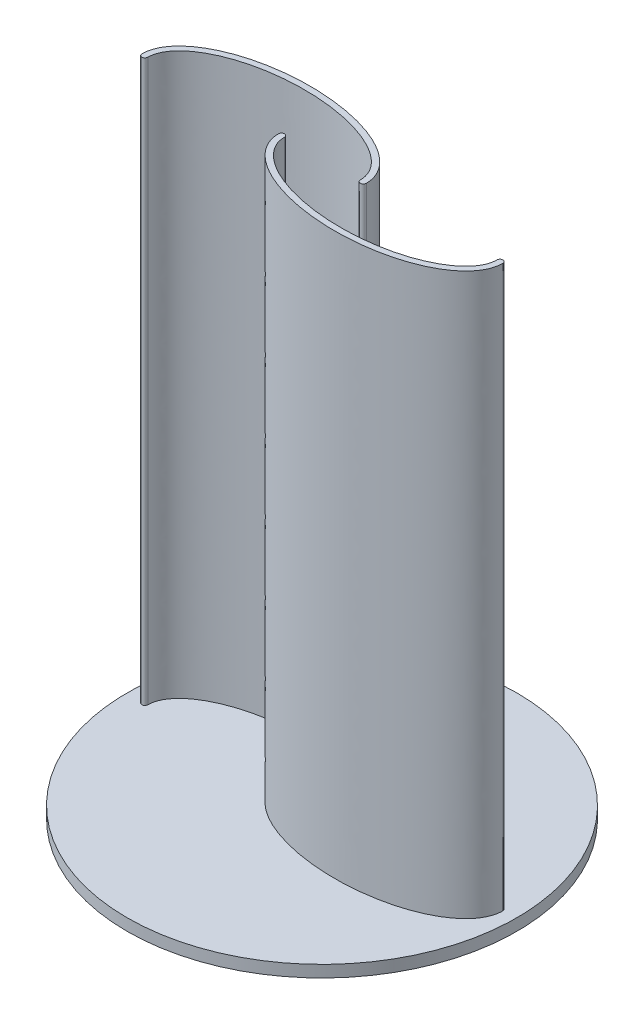
ISO-10303-21;
HEADER;
FILE_DESCRIPTION(('STEP AP214'),'2;1');
FILE_NAME('part.step','',(''),(''),'','','');
FILE_SCHEMA(('AUTOMOTIVE_DESIGN { 1 0 10303 214 1 1 1 1 }'));
ENDSEC;
DATA;
#1=APPLICATION_CONTEXT('core data for automotive mechanical design processes');
#2=APPLICATION_PROTOCOL_DEFINITION('international standard','automotive_design',2000,#1);
#3=PRODUCT_CONTEXT('',#1,'mechanical');
#4=PRODUCT('Part','Part','',(#3));
#5=PRODUCT_RELATED_PRODUCT_CATEGORY('part','',(#4));
#6=PRODUCT_DEFINITION_FORMATION('','',#4);
#7=PRODUCT_DEFINITION_CONTEXT('part definition',#1,'design');
#8=PRODUCT_DEFINITION('design','',#6,#7);
#9=PRODUCT_DEFINITION_SHAPE('','',#8);
#10=(LENGTH_UNIT() NAMED_UNIT(*) SI_UNIT(.MILLI.,.METRE.));
#11=(NAMED_UNIT(*) PLANE_ANGLE_UNIT() SI_UNIT($,.RADIAN.));
#12=(NAMED_UNIT(*) SI_UNIT($,.STERADIAN.) SOLID_ANGLE_UNIT());
#13=UNCERTAINTY_MEASURE_WITH_UNIT(LENGTH_MEASURE(1.E-05),#10,'distance_accuracy_value','');
#14=(GEOMETRIC_REPRESENTATION_CONTEXT(3) GLOBAL_UNCERTAINTY_ASSIGNED_CONTEXT((#13)) GLOBAL_UNIT_ASSIGNED_CONTEXT((#10,
#11,#12)) REPRESENTATION_CONTEXT('',''));
#15=CARTESIAN_POINT('',(0.,0.,0.));
#16=DIRECTION('',(0.,0.,1.));
#17=DIRECTION('',(1.,0.,0.));
#18=AXIS2_PLACEMENT_3D('',#15,#16,#17);
#19=CARTESIAN_POINT('',(0.,0.,0.));
#20=DIRECTION('',(0.,1.,0.));
#21=DIRECTION('',(0.,0.,1.));
#22=AXIS2_PLACEMENT_3D('',#19,#20,#21);
#23=PLANE('',#22);
#24=CARTESIAN_POINT('',(0.,0.,0.));
#25=DIRECTION('',(0.,1.,0.));
#26=DIRECTION('',(0.,0.,1.));
#27=AXIS2_PLACEMENT_3D('',#24,#25,#26);
#28=CIRCLE('',#27,330.);
#29=CARTESIAN_POINT('',(0.,0.,330.));
#30=VERTEX_POINT('',#29);
#31=EDGE_CURVE('E116',#30,#30,#28,.T.);
#32=ORIENTED_EDGE('',*,*,#31,.T.);
#33=EDGE_LOOP('',(#32));
#34=FACE_BOUND('',#33,.T.);
#35=CARTESIAN_POINT('',(70.,0.,0.));
#36=DIRECTION('',(0.,1.,0.));
#37=DIRECTION('',(0.,0.,1.));
#38=AXIS2_PLACEMENT_3D('',#35,#36,#37);
#39=CIRCLE('',#38,5.);
#40=CARTESIAN_POINT('',(75.,0.,0.));
#41=VERTEX_POINT('',#40);
#42=CARTESIAN_POINT('',(65.,0.,0.));
#43=VERTEX_POINT('',#42);
#44=EDGE_CURVE('E194',#41,#43,#39,.F.);
#45=ORIENTED_EDGE('',*,*,#44,.T.);
#46=CARTESIAN_POINT('',(65.,0.,0.));
#47=CARTESIAN_POINT('',(65.,0.,-2.6230982494659));
#48=CARTESIAN_POINT('',(64.4746875253035,0.,-7.82050914147198));
#49=CARTESIAN_POINT('',(62.090181139441,0.,-15.6699622828259));
#50=CARTESIAN_POINT('',(58.0677439881759,0.,-23.4945563482025));
#51=CARTESIAN_POINT('',(50.4921446518239,0.,-33.8114091738083));
#52=CARTESIAN_POINT('',(36.8928019571576,0.,-46.225848965294));
#53=CARTESIAN_POINT('',(14.490118809809,0.,-59.523225114945));
#54=CARTESIAN_POINT('',(-13.0887216448055,0.,-70.5418597532879));
#55=CARTESIAN_POINT('',(-44.7264008775219,0.,-78.7724066663925));
#56=CARTESIAN_POINT('',(-79.1532223977607,0.,-83.8546077500835));
#57=CARTESIAN_POINT('',(-115.,0.,-85.5726961249583));
#58=CARTESIAN_POINT('',(-150.84677760224,0.,-83.8546077500835));
#59=CARTESIAN_POINT('',(-185.273599122478,0.,-78.7724066663925));
#60=CARTESIAN_POINT('',(-216.911278355195,0.,-70.5418597532879));
#61=CARTESIAN_POINT('',(-244.490118809809,0.,-59.523225114945));
#62=CARTESIAN_POINT('',(-266.892801957158,0.,-46.225848965294));
#63=CARTESIAN_POINT('',(-280.492144651824,0.,-33.8114091738083));
#64=CARTESIAN_POINT('',(-288.067743988176,0.,-23.4945563482024));
#65=CARTESIAN_POINT('',(-292.090181139441,0.,-15.6699622828258));
#66=CARTESIAN_POINT('',(-294.474687525304,0.,-7.82050914147193));
#67=CARTESIAN_POINT('',(-295.,0.,-2.62309824946584));
#68=CARTESIAN_POINT('',(-295.,0.,0.));
#69=B_SPLINE_CURVE_WITH_KNOTS('',3,(#46,#47,#48,#49,#50,#51,#52,#53,#54,#55,#56,#57,#58,#59,#60,
#61,#62,#63,#64,#65,#66,#67,#68),.UNSPECIFIED.,.F.,.F.,(4,1,1,1,1,1,1,1,1,1,1,1,1,1,1,1,1,1,1,1,
4),(0.,0.0981747704246811,0.196349540849362,0.294524311274043,0.392699081698724,
0.589048622548086,0.785398163397449,0.981747704246811,1.17809724509617,1.37444678594554,
1.5707963267949,1.76714586764426,1.96349540849362,2.15984494934298,2.35619449019235,
2.55254403104171,2.74889357189107,2.84706834231575,2.94524311274043,3.04341788316511,
3.14159265358979),.UNSPECIFIED.);
#70=CARTESIAN_POINT('',(-295.,0.,0.));
#71=VERTEX_POINT('',#70);
#72=EDGE_CURVE('E189',#43,#71,#69,.T.);
#73=ORIENTED_EDGE('',*,*,#72,.T.);
#74=CARTESIAN_POINT('',(-300.,0.,0.));
#75=DIRECTION('',(0.,1.,0.));
#76=DIRECTION('',(0.,0.,1.));
#77=AXIS2_PLACEMENT_3D('',#74,#75,#76);
#78=CIRCLE('',#77,5.);
#79=CARTESIAN_POINT('',(-305.,0.,0.));
#80=VERTEX_POINT('',#79);
#81=EDGE_CURVE('E205',#80,#71,#78,.T.);
#82=ORIENTED_EDGE('',*,*,#81,.F.);
#83=CARTESIAN_POINT('',(75.,0.,0.));
#84=CARTESIAN_POINT('',(75.,0.,-3.28784020371299));
#85=CARTESIAN_POINT('',(74.3356593466837,0.,-9.84121686231741));
#86=CARTESIAN_POINT('',(70.3997109122801,0.,-22.7277284859852));
#87=CARTESIAN_POINT('',(60.8247211158811,0.,-38.0009422056469));
#88=CARTESIAN_POINT('',(42.7346393341913,0.,-54.4207270814239));
#89=CARTESIAN_POINT('',(18.825921029807,0.,-68.5768589381955));
#90=CARTESIAN_POINT('',(-10.0258247708729,0.,-80.0865516689035));
#91=CARTESIAN_POINT('',(-53.6787730708616,0.,-91.4392092816324));
#92=CARTESIAN_POINT('',(-115.,0.,-97.3738604789117));
#93=CARTESIAN_POINT('',(-176.321226929139,0.,-91.4392092816324));
#94=CARTESIAN_POINT('',(-219.974175229127,0.,-80.0865516689035));
#95=CARTESIAN_POINT('',(-248.825921029807,0.,-68.5768589381955));
#96=CARTESIAN_POINT('',(-272.734639334192,0.,-54.4207270814239));
#97=CARTESIAN_POINT('',(-290.824721115881,0.,-38.0009422056468));
#98=CARTESIAN_POINT('',(-300.39971091228,0.,-22.7277284859851));
#99=CARTESIAN_POINT('',(-304.335659346684,0.,-9.84121686231733));
#100=CARTESIAN_POINT('',(-305.,0.,-3.28784020371291));
#101=CARTESIAN_POINT('',(-305.,0.,0.));
#102=B_SPLINE_CURVE_WITH_KNOTS('',3,(#83,#84,#85,#86,#87,#88,#89,#90,#91,#92,#93,#94,#95,#96,
#97,#98,#99,#100,#101),.UNSPECIFIED.,.F.,.F.,(4,1,1,1,1,1,1,1,1,1,1,1,1,1,1,1,4),(0.,
0.0981747704246811,0.196349540849362,0.392699081698724,0.589048622548086,0.785398163397449,
0.981747704246811,1.17809724509617,1.5707963267949,1.96349540849362,2.15984494934298,
2.35619449019235,2.55254403104171,2.74889357189107,2.94524311274043,3.04341788316511,
3.14159265358979),.UNSPECIFIED.);
#103=EDGE_CURVE('E201',#41,#80,#102,.T.);
#104=ORIENTED_EDGE('',*,*,#103,.F.);
#105=EDGE_LOOP('',(#45,#73,#82,#104));
#106=FACE_BOUND('',#105,.T.);
#107=CARTESIAN_POINT('',(-61.9293275410539,0.,1.67827771019427));
#108=CARTESIAN_POINT('',(-61.9293275410539,0.,4.30137595966018));
#109=CARTESIAN_POINT('',(-61.4040150663574,0.,9.49878685166627));
#110=CARTESIAN_POINT('',(-59.0195086804949,0.,17.3482399930202));
#111=CARTESIAN_POINT('',(-54.9970715292298,0.,25.1728340583968));
#112=CARTESIAN_POINT('',(-47.4214721928778,0.,35.4896868840026));
#113=CARTESIAN_POINT('',(-33.8221294982115,0.,47.9041266754883));
#114=CARTESIAN_POINT('',(-11.4194463508629,0.,61.2015028251393));
#115=CARTESIAN_POINT('',(16.1593941037516,0.,72.2201374634822));
#116=CARTESIAN_POINT('',(47.797073336468,0.,80.4506843765868));
#117=CARTESIAN_POINT('',(82.2238948567068,0.,85.5328854602778));
#118=CARTESIAN_POINT('',(118.070672458946,0.,87.2509738351526));
#119=CARTESIAN_POINT('',(153.917450061186,0.,85.5328854602778));
#120=CARTESIAN_POINT('',(188.344271581424,0.,80.4506843765868));
#121=CARTESIAN_POINT('',(219.981950814141,0.,72.2201374634822));
#122=CARTESIAN_POINT('',(247.560791268755,0.,61.2015028251392));
#123=CARTESIAN_POINT('',(269.963474416104,0.,47.9041266754883));
#124=CARTESIAN_POINT('',(283.56281711077,0.,35.4896868840026));
#125=CARTESIAN_POINT('',(291.138416447122,0.,25.1728340583967));
#126=CARTESIAN_POINT('',(295.160853598387,0.,17.3482399930201));
#127=CARTESIAN_POINT('',(297.54535998425,0.,9.49878685166621));
#128=CARTESIAN_POINT('',(298.070672458946,0.,4.30137595966013));
#129=CARTESIAN_POINT('',(298.070672458946,0.,1.67827771019422));
#130=B_SPLINE_CURVE_WITH_KNOTS('',3,(#107,#108,#109,#110,#111,#112,#113,#114,#115,#116,#117,
#118,#119,#120,#121,#122,#123,#124,#125,#126,#127,#128,#129),.UNSPECIFIED.,.F.,.F.,(4,1,1,1,1,1,
1,1,1,1,1,1,1,1,1,1,1,1,1,1,4),(0.,0.0981747704246811,0.196349540849362,0.294524311274043,
0.392699081698724,0.589048622548086,0.785398163397449,0.981747704246811,1.17809724509617,
1.37444678594554,1.5707963267949,1.76714586764426,1.96349540849362,2.15984494934298,
2.35619449019235,2.55254403104171,2.74889357189107,2.84706834231575,2.94524311274043,
3.04341788316511,3.14159265358979),.UNSPECIFIED.);
#131=CARTESIAN_POINT('',(-61.9293275410539,0.,1.67827771019427));
#132=VERTEX_POINT('',#131);
#133=CARTESIAN_POINT('',(298.070672458946,0.,1.67827771019422));
#134=VERTEX_POINT('',#133);
#135=EDGE_CURVE('E111',#132,#134,#130,.T.);
#136=ORIENTED_EDGE('',*,*,#135,.T.);
#137=CARTESIAN_POINT('',(303.070672458946,0.,1.6782777101942));
#138=DIRECTION('',(0.,1.,0.));
#139=DIRECTION('',(0.,0.,-1.));
#140=AXIS2_PLACEMENT_3D('',#137,#138,#139);
#141=CIRCLE('',#140,5.);
#142=CARTESIAN_POINT('',(308.070672458946,0.,1.6782777101942));
#143=VERTEX_POINT('',#142);
#144=EDGE_CURVE('E125',#143,#134,#141,.T.);
#145=ORIENTED_EDGE('',*,*,#144,.F.);
#146=CARTESIAN_POINT('',(-71.9293275410539,0.,1.67827771019427));
#147=CARTESIAN_POINT('',(-71.9293275410539,0.,4.96611791390727));
#148=CARTESIAN_POINT('',(-71.2649868877376,0.,11.5194945725117));
#149=CARTESIAN_POINT('',(-67.329038453334,0.,24.4060061961795));
#150=CARTESIAN_POINT('',(-57.754048656935,0.,39.6792199158412));
#151=CARTESIAN_POINT('',(-39.6639668752453,0.,56.0990047916182));
#152=CARTESIAN_POINT('',(-15.755248570861,0.,70.2551366483898));
#153=CARTESIAN_POINT('',(13.096497229819,0.,81.7648293790978));
#154=CARTESIAN_POINT('',(56.7494455298077,0.,93.1174869918267));
#155=CARTESIAN_POINT('',(118.070672458946,0.,99.052138189106));
#156=CARTESIAN_POINT('',(179.391899388085,0.,93.1174869918267));
#157=CARTESIAN_POINT('',(223.044847688073,0.,81.7648293790978));
#158=CARTESIAN_POINT('',(251.896593488753,0.,70.2551366483898));
#159=CARTESIAN_POINT('',(275.805311793138,0.,56.0990047916182));
#160=CARTESIAN_POINT('',(293.895393574827,0.,39.6792199158411));
#161=CARTESIAN_POINT('',(303.470383371226,0.,24.4060061961794));
#162=CARTESIAN_POINT('',(307.40633180563,0.,11.5194945725116));
#163=CARTESIAN_POINT('',(308.070672458946,0.,4.9661179139072));
#164=CARTESIAN_POINT('',(308.070672458946,0.,1.6782777101942));
#165=B_SPLINE_CURVE_WITH_KNOTS('',3,(#146,#147,#148,#149,#150,#151,#152,#153,#154,#155,#156,
#157,#158,#159,#160,#161,#162,#163,#164),.UNSPECIFIED.,.F.,.F.,(4,1,1,1,1,1,1,1,1,1,1,1,1,1,1,1,
4),(0.,0.0981747704246811,0.196349540849362,0.392699081698724,0.589048622548086,
0.785398163397449,0.981747704246811,1.17809724509617,1.5707963267949,1.96349540849362,
2.15984494934298,2.35619449019235,2.55254403104171,2.74889357189107,2.94524311274043,
3.04341788316511,3.14159265358979),.UNSPECIFIED.);
#166=CARTESIAN_POINT('',(-71.9293275410539,0.,1.67827771019427));
#167=VERTEX_POINT('',#166);
#168=EDGE_CURVE('E240',#167,#143,#165,.T.);
#169=ORIENTED_EDGE('',*,*,#168,.F.);
#170=CARTESIAN_POINT('',(-66.9293275410539,0.,1.67827771019427));
#171=DIRECTION('',(0.,1.,0.));
#172=DIRECTION('',(0.,0.,-1.));
#173=AXIS2_PLACEMENT_3D('',#170,#171,#172);
#174=CIRCLE('',#173,5.);
#175=EDGE_CURVE('E244',#167,#132,#174,.F.);
#176=ORIENTED_EDGE('',*,*,#175,.T.);
#177=EDGE_LOOP('',(#136,#145,#169,#176));
#178=FACE_BOUND('',#177,.T.);
#179=ADVANCED_FACE('F33',(#34,#106,#178),#23,.T.);
#180=CARTESIAN_POINT('',(65.,950.,0.));
#181=CARTESIAN_POINT('',(65.,950.,-2.6230982494659));
#182=CARTESIAN_POINT('',(64.4746875253035,950.,-7.82050914147198));
#183=CARTESIAN_POINT('',(62.090181139441,950.,-15.6699622828259));
#184=CARTESIAN_POINT('',(58.0677439881759,950.,-23.4945563482025));
#185=CARTESIAN_POINT('',(50.4921446518239,950.,-33.8114091738083));
#186=CARTESIAN_POINT('',(36.8928019571576,950.,-46.225848965294));
#187=CARTESIAN_POINT('',(14.490118809809,950.,-59.523225114945));
#188=CARTESIAN_POINT('',(-13.0887216448055,950.,-70.5418597532879));
#189=CARTESIAN_POINT('',(-44.7264008775219,950.,-78.7724066663925));
#190=CARTESIAN_POINT('',(-79.1532223977607,950.,-83.8546077500835));
#191=CARTESIAN_POINT('',(-115.,950.,-85.5726961249583));
#192=CARTESIAN_POINT('',(-150.84677760224,950.,-83.8546077500835));
#193=CARTESIAN_POINT('',(-185.273599122478,950.,-78.7724066663925));
#194=CARTESIAN_POINT('',(-216.911278355195,950.,-70.5418597532879));
#195=CARTESIAN_POINT('',(-244.490118809809,950.,-59.523225114945));
#196=CARTESIAN_POINT('',(-266.892801957158,950.,-46.225848965294));
#197=CARTESIAN_POINT('',(-280.492144651824,950.,-33.8114091738083));
#198=CARTESIAN_POINT('',(-288.067743988176,950.,-23.4945563482024));
#199=CARTESIAN_POINT('',(-292.090181139441,950.,-15.6699622828258));
#200=CARTESIAN_POINT('',(-294.474687525304,950.,-7.82050914147193));
#201=CARTESIAN_POINT('',(-295.,950.,-2.62309824946584));
#202=CARTESIAN_POINT('',(-295.,950.,0.));
#203=B_SPLINE_CURVE_WITH_KNOTS('',3,(#180,#181,#182,#183,#184,#185,#186,#187,#188,#189,#190,
#191,#192,#193,#194,#195,#196,#197,#198,#199,#200,#201,#202),.UNSPECIFIED.,.F.,.F.,(4,1,1,1,1,1,
1,1,1,1,1,1,1,1,1,1,1,1,1,1,4),(0.,0.0981747704246811,0.196349540849362,0.294524311274043,
0.392699081698724,0.589048622548086,0.785398163397449,0.981747704246811,1.17809724509617,
1.37444678594554,1.5707963267949,1.76714586764426,1.96349540849362,2.15984494934298,
2.35619449019235,2.55254403104171,2.74889357189107,2.84706834231575,2.94524311274043,
3.04341788316511,3.14159265358979),.UNSPECIFIED.);
#204=DIRECTION('',(0.,-1.,0.));
#205=VECTOR('',#204,1.);
#206=SURFACE_OF_LINEAR_EXTRUSION('',#203,#205);
#207=ORIENTED_EDGE('',*,*,#72,.F.);
#208=DIRECTION('',(0.,-1.,0.));
#209=VECTOR('',#208,1.);
#210=CARTESIAN_POINT('',(65.,950.,0.));
#211=LINE('',#210,#209);
#212=CARTESIAN_POINT('',(65.,950.,0.));
#213=VERTEX_POINT('',#212);
#214=EDGE_CURVE('E11',#213,#43,#211,.T.);
#215=ORIENTED_EDGE('',*,*,#214,.F.);
#216=CARTESIAN_POINT('',(-295.,950.,0.));
#217=VERTEX_POINT('',#216);
#218=EDGE_CURVE('E210',#213,#217,#203,.T.);
#219=ORIENTED_EDGE('',*,*,#218,.T.);
#220=DIRECTION('',(0.,-1.,0.));
#221=VECTOR('',#220,1.);
#222=CARTESIAN_POINT('',(-295.,950.,0.));
#223=LINE('',#222,#221);
#224=EDGE_CURVE('E76',#217,#71,#223,.T.);
#225=ORIENTED_EDGE('',*,*,#224,.T.);
#226=EDGE_LOOP('',(#207,#215,#219,#225));
#227=FACE_BOUND('',#226,.T.);
#228=ADVANCED_FACE('F35',(#227),#206,.T.);
#229=CARTESIAN_POINT('',(70.,950.,0.));
#230=DIRECTION('',(0.,-1.,0.));
#231=DIRECTION('',(0.,0.,-1.));
#232=AXIS2_PLACEMENT_3D('',#229,#230,#231);
#233=CYLINDRICAL_SURFACE('',#232,5.);
#234=ORIENTED_EDGE('',*,*,#44,.F.);
#235=DIRECTION('',(0.,-1.,0.));
#236=VECTOR('',#235,1.);
#237=CARTESIAN_POINT('',(75.,950.,0.));
#238=LINE('',#237,#236);
#239=CARTESIAN_POINT('',(75.,950.,0.));
#240=VERTEX_POINT('',#239);
#241=EDGE_CURVE('E42',#240,#41,#238,.T.);
#242=ORIENTED_EDGE('',*,*,#241,.F.);
#243=CARTESIAN_POINT('',(70.,950.,0.));
#244=DIRECTION('',(0.,1.,0.));
#245=DIRECTION('',(0.,0.,1.));
#246=AXIS2_PLACEMENT_3D('',#243,#244,#245);
#247=CIRCLE('',#246,5.);
#248=EDGE_CURVE('E184',#240,#213,#247,.F.);
#249=ORIENTED_EDGE('',*,*,#248,.T.);
#250=ORIENTED_EDGE('',*,*,#214,.T.);
#251=EDGE_LOOP('',(#234,#242,#249,#250));
#252=FACE_BOUND('',#251,.T.);
#253=ADVANCED_FACE('F176',(#252),#233,.T.);
#254=CARTESIAN_POINT('',(75.,950.,0.));
#255=CARTESIAN_POINT('',(75.,950.,-3.28784020371299));
#256=CARTESIAN_POINT('',(74.3356593466837,950.,-9.84121686231741));
#257=CARTESIAN_POINT('',(70.3997109122801,950.,-22.7277284859852));
#258=CARTESIAN_POINT('',(60.8247211158811,950.,-38.0009422056469));
#259=CARTESIAN_POINT('',(42.7346393341913,950.,-54.4207270814239));
#260=CARTESIAN_POINT('',(18.825921029807,950.,-68.5768589381955));
#261=CARTESIAN_POINT('',(-10.0258247708729,950.,-80.0865516689035));
#262=CARTESIAN_POINT('',(-53.6787730708616,950.,-91.4392092816324));
#263=CARTESIAN_POINT('',(-115.,950.,-97.3738604789117));
#264=CARTESIAN_POINT('',(-176.321226929139,950.,-91.4392092816324));
#265=CARTESIAN_POINT('',(-219.974175229127,950.,-80.0865516689035));
#266=CARTESIAN_POINT('',(-248.825921029807,950.,-68.5768589381955));
#267=CARTESIAN_POINT('',(-272.734639334192,950.,-54.4207270814239));
#268=CARTESIAN_POINT('',(-290.824721115881,950.,-38.0009422056468));
#269=CARTESIAN_POINT('',(-300.39971091228,950.,-22.7277284859851));
#270=CARTESIAN_POINT('',(-304.335659346684,950.,-9.84121686231733));
#271=CARTESIAN_POINT('',(-305.,950.,-3.28784020371291));
#272=CARTESIAN_POINT('',(-305.,950.,0.));
#273=B_SPLINE_CURVE_WITH_KNOTS('',3,(#254,#255,#256,#257,#258,#259,#260,#261,#262,#263,#264,
#265,#266,#267,#268,#269,#270,#271,#272),.UNSPECIFIED.,.F.,.F.,(4,1,1,1,1,1,1,1,1,1,1,1,1,1,1,1,
4),(0.,0.0981747704246811,0.196349540849362,0.392699081698724,0.589048622548086,
0.785398163397449,0.981747704246811,1.17809724509617,1.5707963267949,1.96349540849362,
2.15984494934298,2.35619449019235,2.55254403104171,2.74889357189107,2.94524311274043,
3.04341788316511,3.14159265358979),.UNSPECIFIED.);
#274=DIRECTION('',(0.,-1.,0.));
#275=VECTOR('',#274,1.);
#276=SURFACE_OF_LINEAR_EXTRUSION('',#273,#275);
#277=ORIENTED_EDGE('',*,*,#103,.T.);
#278=DIRECTION('',(0.,-1.,0.));
#279=VECTOR('',#278,1.);
#280=CARTESIAN_POINT('',(-305.,950.,0.));
#281=LINE('',#280,#279);
#282=CARTESIAN_POINT('',(-305.,950.,0.));
#283=VERTEX_POINT('',#282);
#284=EDGE_CURVE('E212',#283,#80,#281,.T.);
#285=ORIENTED_EDGE('',*,*,#284,.F.);
#286=EDGE_CURVE('E178',#240,#283,#273,.T.);
#287=ORIENTED_EDGE('',*,*,#286,.F.);
#288=ORIENTED_EDGE('',*,*,#241,.T.);
#289=EDGE_LOOP('',(#277,#285,#287,#288));
#290=FACE_BOUND('',#289,.T.);
#291=ADVANCED_FACE('F172',(#290),#276,.F.);
#292=CARTESIAN_POINT('',(-300.,950.,0.));
#293=DIRECTION('',(0.,-1.,0.));
#294=DIRECTION('',(0.,0.,-1.));
#295=AXIS2_PLACEMENT_3D('',#292,#293,#294);
#296=CYLINDRICAL_SURFACE('',#295,5.);
#297=ORIENTED_EDGE('',*,*,#81,.T.);
#298=ORIENTED_EDGE('',*,*,#224,.F.);
#299=CARTESIAN_POINT('',(-300.,950.,0.));
#300=DIRECTION('',(0.,1.,0.));
#301=DIRECTION('',(0.,0.,1.));
#302=AXIS2_PLACEMENT_3D('',#299,#300,#301);
#303=CIRCLE('',#302,5.);
#304=EDGE_CURVE('E58',#283,#217,#303,.T.);
#305=ORIENTED_EDGE('',*,*,#304,.F.);
#306=ORIENTED_EDGE('',*,*,#284,.T.);
#307=EDGE_LOOP('',(#297,#298,#305,#306));
#308=FACE_BOUND('',#307,.T.);
#309=ADVANCED_FACE('F169',(#308),#296,.T.);
#310=CARTESIAN_POINT('',(0.,950.,0.));
#311=DIRECTION('',(0.,1.,0.));
#312=DIRECTION('',(0.,0.,1.));
#313=AXIS2_PLACEMENT_3D('',#310,#311,#312);
#314=PLANE('',#313);
#315=ORIENTED_EDGE('',*,*,#218,.F.);
#316=ORIENTED_EDGE('',*,*,#248,.F.);
#317=ORIENTED_EDGE('',*,*,#286,.T.);
#318=ORIENTED_EDGE('',*,*,#304,.T.);
#319=EDGE_LOOP('',(#315,#316,#317,#318));
#320=FACE_BOUND('',#319,.T.);
#321=ADVANCED_FACE('F165',(#320),#314,.T.);
#322=CARTESIAN_POINT('',(0.,-20.,0.));
#323=DIRECTION('',(0.,1.,0.));
#324=DIRECTION('',(0.,0.,1.));
#325=AXIS2_PLACEMENT_3D('',#322,#323,#324);
#326=CYLINDRICAL_SURFACE('',#325,330.);
#327=CARTESIAN_POINT('',(0.,-20.,0.));
#328=DIRECTION('',(0.,1.,0.));
#329=DIRECTION('',(0.,0.,1.));
#330=AXIS2_PLACEMENT_3D('',#327,#328,#329);
#331=CIRCLE('',#330,330.);
#332=CARTESIAN_POINT('',(0.,-20.,330.));
#333=VERTEX_POINT('',#332);
#334=EDGE_CURVE('E195',#333,#333,#331,.T.);
#335=ORIENTED_EDGE('',*,*,#334,.T.);
#336=EDGE_LOOP('',(#335));
#337=FACE_BOUND('',#336,.T.);
#338=ORIENTED_EDGE('',*,*,#31,.F.);
#339=EDGE_LOOP('',(#338));
#340=FACE_BOUND('',#339,.T.);
#341=ADVANCED_FACE('F158',(#337,#340),#326,.T.);
#342=CARTESIAN_POINT('',(0.,-20.,0.));
#343=DIRECTION('',(0.,1.,0.));
#344=DIRECTION('',(0.,0.,1.));
#345=AXIS2_PLACEMENT_3D('',#342,#343,#344);
#346=PLANE('',#345);
#347=ORIENTED_EDGE('',*,*,#334,.F.);
#348=EDGE_LOOP('',(#347));
#349=FACE_BOUND('',#348,.T.);
#350=ADVANCED_FACE('F155',(#349),#346,.F.);
#351=CARTESIAN_POINT('',(-61.9293275410539,950.,1.67827771019427));
#352=CARTESIAN_POINT('',(-61.9293275410539,950.,4.30137595966018));
#353=CARTESIAN_POINT('',(-61.4040150663574,950.,9.49878685166627));
#354=CARTESIAN_POINT('',(-59.0195086804949,950.,17.3482399930202));
#355=CARTESIAN_POINT('',(-54.9970715292298,950.,25.1728340583968));
#356=CARTESIAN_POINT('',(-47.4214721928778,950.,35.4896868840026));
#357=CARTESIAN_POINT('',(-33.8221294982115,950.,47.9041266754883));
#358=CARTESIAN_POINT('',(-11.4194463508629,950.,61.2015028251393));
#359=CARTESIAN_POINT('',(16.1593941037516,950.,72.2201374634822));
#360=CARTESIAN_POINT('',(47.797073336468,950.,80.4506843765868));
#361=CARTESIAN_POINT('',(82.2238948567068,950.,85.5328854602778));
#362=CARTESIAN_POINT('',(118.070672458946,950.,87.2509738351526));
#363=CARTESIAN_POINT('',(153.917450061186,950.,85.5328854602778));
#364=CARTESIAN_POINT('',(188.344271581424,950.,80.4506843765868));
#365=CARTESIAN_POINT('',(219.981950814141,950.,72.2201374634822));
#366=CARTESIAN_POINT('',(247.560791268755,950.,61.2015028251392));
#367=CARTESIAN_POINT('',(269.963474416104,950.,47.9041266754883));
#368=CARTESIAN_POINT('',(283.56281711077,950.,35.4896868840026));
#369=CARTESIAN_POINT('',(291.138416447122,950.,25.1728340583967));
#370=CARTESIAN_POINT('',(295.160853598387,950.,17.3482399930201));
#371=CARTESIAN_POINT('',(297.54535998425,950.,9.49878685166621));
#372=CARTESIAN_POINT('',(298.070672458946,950.,4.30137595966013));
#373=CARTESIAN_POINT('',(298.070672458946,950.,1.67827771019422));
#374=B_SPLINE_CURVE_WITH_KNOTS('',3,(#351,#352,#353,#354,#355,#356,#357,#358,#359,#360,#361,
#362,#363,#364,#365,#366,#367,#368,#369,#370,#371,#372,#373),.UNSPECIFIED.,.F.,.F.,(4,1,1,1,1,1,
1,1,1,1,1,1,1,1,1,1,1,1,1,1,4),(0.,0.0981747704246811,0.196349540849362,0.294524311274043,
0.392699081698724,0.589048622548086,0.785398163397449,0.981747704246811,1.17809724509617,
1.37444678594554,1.5707963267949,1.76714586764426,1.96349540849362,2.15984494934298,
2.35619449019235,2.55254403104171,2.74889357189107,2.84706834231575,2.94524311274043,
3.04341788316511,3.14159265358979),.UNSPECIFIED.);
#375=DIRECTION('',(0.,-1.,0.));
#376=VECTOR('',#375,1.);
#377=SURFACE_OF_LINEAR_EXTRUSION('',#374,#376);
#378=ORIENTED_EDGE('',*,*,#135,.F.);
#379=DIRECTION('',(0.,-1.,0.));
#380=VECTOR('',#379,1.);
#381=CARTESIAN_POINT('',(-61.9293275410539,950.,1.67827771019427));
#382=LINE('',#381,#380);
#383=CARTESIAN_POINT('',(-61.9293275410539,950.,1.67827771019427));
#384=VERTEX_POINT('',#383);
#385=EDGE_CURVE('E106',#384,#132,#382,.T.);
#386=ORIENTED_EDGE('',*,*,#385,.F.);
#387=CARTESIAN_POINT('',(298.070672458946,950.,1.67827771019422));
#388=VERTEX_POINT('',#387);
#389=EDGE_CURVE('E109',#384,#388,#374,.T.);
#390=ORIENTED_EDGE('',*,*,#389,.T.);
#391=DIRECTION('',(0.,-1.,0.));
#392=VECTOR('',#391,1.);
#393=CARTESIAN_POINT('',(298.070672458946,950.,1.67827771019422));
#394=LINE('',#393,#392);
#395=EDGE_CURVE('E237',#388,#134,#394,.T.);
#396=ORIENTED_EDGE('',*,*,#395,.T.);
#397=EDGE_LOOP('',(#378,#386,#390,#396));
#398=FACE_BOUND('',#397,.T.);
#399=ADVANCED_FACE('F108',(#398),#377,.T.);
#400=CARTESIAN_POINT('',(-66.9293275410539,950.,1.67827771019427));
#401=DIRECTION('',(0.,-1.,0.));
#402=DIRECTION('',(0.,0.,-1.));
#403=AXIS2_PLACEMENT_3D('',#400,#401,#402);
#404=CYLINDRICAL_SURFACE('',#403,5.);
#405=ORIENTED_EDGE('',*,*,#175,.F.);
#406=DIRECTION('',(0.,-1.,0.));
#407=VECTOR('',#406,1.);
#408=CARTESIAN_POINT('',(-71.9293275410539,950.,1.67827771019427));
#409=LINE('',#408,#407);
#410=CARTESIAN_POINT('',(-71.9293275410539,950.,1.67827771019427));
#411=VERTEX_POINT('',#410);
#412=EDGE_CURVE('E117',#411,#167,#409,.T.);
#413=ORIENTED_EDGE('',*,*,#412,.F.);
#414=CARTESIAN_POINT('',(-66.9293275410539,950.,1.67827771019427));
#415=DIRECTION('',(0.,1.,0.));
#416=DIRECTION('',(0.,0.,-1.));
#417=AXIS2_PLACEMENT_3D('',#414,#415,#416);
#418=CIRCLE('',#417,5.);
#419=EDGE_CURVE('E122',#411,#384,#418,.F.);
#420=ORIENTED_EDGE('',*,*,#419,.T.);
#421=ORIENTED_EDGE('',*,*,#385,.T.);
#422=EDGE_LOOP('',(#405,#413,#420,#421));
#423=FACE_BOUND('',#422,.T.);
#424=ADVANCED_FACE('F127',(#423),#404,.T.);
#425=CARTESIAN_POINT('',(-71.9293275410539,950.,1.67827771019427));
#426=CARTESIAN_POINT('',(-71.9293275410539,950.,4.96611791390727));
#427=CARTESIAN_POINT('',(-71.2649868877376,950.,11.5194945725117));
#428=CARTESIAN_POINT('',(-67.329038453334,950.,24.4060061961795));
#429=CARTESIAN_POINT('',(-57.754048656935,950.,39.6792199158412));
#430=CARTESIAN_POINT('',(-39.6639668752453,950.,56.0990047916182));
#431=CARTESIAN_POINT('',(-15.755248570861,950.,70.2551366483898));
#432=CARTESIAN_POINT('',(13.096497229819,950.,81.7648293790978));
#433=CARTESIAN_POINT('',(56.7494455298077,950.,93.1174869918267));
#434=CARTESIAN_POINT('',(118.070672458946,950.,99.052138189106));
#435=CARTESIAN_POINT('',(179.391899388085,950.,93.1174869918267));
#436=CARTESIAN_POINT('',(223.044847688073,950.,81.7648293790978));
#437=CARTESIAN_POINT('',(251.896593488753,950.,70.2551366483898));
#438=CARTESIAN_POINT('',(275.805311793138,950.,56.0990047916182));
#439=CARTESIAN_POINT('',(293.895393574827,950.,39.6792199158411));
#440=CARTESIAN_POINT('',(303.470383371226,950.,24.4060061961794));
#441=CARTESIAN_POINT('',(307.40633180563,950.,11.5194945725116));
#442=CARTESIAN_POINT('',(308.070672458946,950.,4.9661179139072));
#443=CARTESIAN_POINT('',(308.070672458946,950.,1.6782777101942));
#444=B_SPLINE_CURVE_WITH_KNOTS('',3,(#425,#426,#427,#428,#429,#430,#431,#432,#433,#434,#435,
#436,#437,#438,#439,#440,#441,#442,#443),.UNSPECIFIED.,.F.,.F.,(4,1,1,1,1,1,1,1,1,1,1,1,1,1,1,1,
4),(0.,0.0981747704246811,0.196349540849362,0.392699081698724,0.589048622548086,
0.785398163397449,0.981747704246811,1.17809724509617,1.5707963267949,1.96349540849362,
2.15984494934298,2.35619449019235,2.55254403104171,2.74889357189107,2.94524311274043,
3.04341788316511,3.14159265358979),.UNSPECIFIED.);
#445=DIRECTION('',(0.,-1.,0.));
#446=VECTOR('',#445,1.);
#447=SURFACE_OF_LINEAR_EXTRUSION('',#444,#446);
#448=ORIENTED_EDGE('',*,*,#168,.T.);
#449=DIRECTION('',(0.,-1.,0.));
#450=VECTOR('',#449,1.);
#451=CARTESIAN_POINT('',(308.070672458946,950.,1.6782777101942));
#452=LINE('',#451,#450);
#453=CARTESIAN_POINT('',(308.070672458946,950.,1.6782777101942));
#454=VERTEX_POINT('',#453);
#455=EDGE_CURVE('E49',#454,#143,#452,.T.);
#456=ORIENTED_EDGE('',*,*,#455,.F.);
#457=EDGE_CURVE('E129',#411,#454,#444,.T.);
#458=ORIENTED_EDGE('',*,*,#457,.F.);
#459=ORIENTED_EDGE('',*,*,#412,.T.);
#460=EDGE_LOOP('',(#448,#456,#458,#459));
#461=FACE_BOUND('',#460,.T.);
#462=ADVANCED_FACE('F144',(#461),#447,.F.);
#463=CARTESIAN_POINT('',(303.070672458946,950.,1.6782777101942));
#464=DIRECTION('',(0.,-1.,0.));
#465=DIRECTION('',(0.,0.,-1.));
#466=AXIS2_PLACEMENT_3D('',#463,#464,#465);
#467=CYLINDRICAL_SURFACE('',#466,5.);
#468=ORIENTED_EDGE('',*,*,#144,.T.);
#469=ORIENTED_EDGE('',*,*,#395,.F.);
#470=CARTESIAN_POINT('',(303.070672458946,950.,1.6782777101942));
#471=DIRECTION('',(0.,1.,0.));
#472=DIRECTION('',(0.,0.,-1.));
#473=AXIS2_PLACEMENT_3D('',#470,#471,#472);
#474=CIRCLE('',#473,5.);
#475=EDGE_CURVE('E123',#454,#388,#474,.T.);
#476=ORIENTED_EDGE('',*,*,#475,.F.);
#477=ORIENTED_EDGE('',*,*,#455,.T.);
#478=EDGE_LOOP('',(#468,#469,#476,#477));
#479=FACE_BOUND('',#478,.T.);
#480=ADVANCED_FACE('F148',(#479),#467,.T.);
#481=CARTESIAN_POINT('',(3.07067245894609,950.,1.67827771019428));
#482=DIRECTION('',(0.,1.,0.));
#483=DIRECTION('',(0.,0.,-1.));
#484=AXIS2_PLACEMENT_3D('',#481,#482,#483);
#485=PLANE('',#484);
#486=ORIENTED_EDGE('',*,*,#389,.F.);
#487=ORIENTED_EDGE('',*,*,#419,.F.);
#488=ORIENTED_EDGE('',*,*,#457,.T.);
#489=ORIENTED_EDGE('',*,*,#475,.T.);
#490=EDGE_LOOP('',(#486,#487,#488,#489));
#491=FACE_BOUND('',#490,.T.);
#492=ADVANCED_FACE('F121',(#491),#485,.T.);
#493=CLOSED_SHELL('',(#179,#228,#253,#291,#309,#321,#341,#350,#399,#424,#462,#480,#492));
#494=MANIFOLD_SOLID_BREP('B2',#493);
#495=ADVANCED_BREP_SHAPE_REPRESENTATION('',(#18,#494),#14);
#496=SHAPE_DEFINITION_REPRESENTATION(#9,#495);
ENDSEC;
END-ISO-10303-21;
